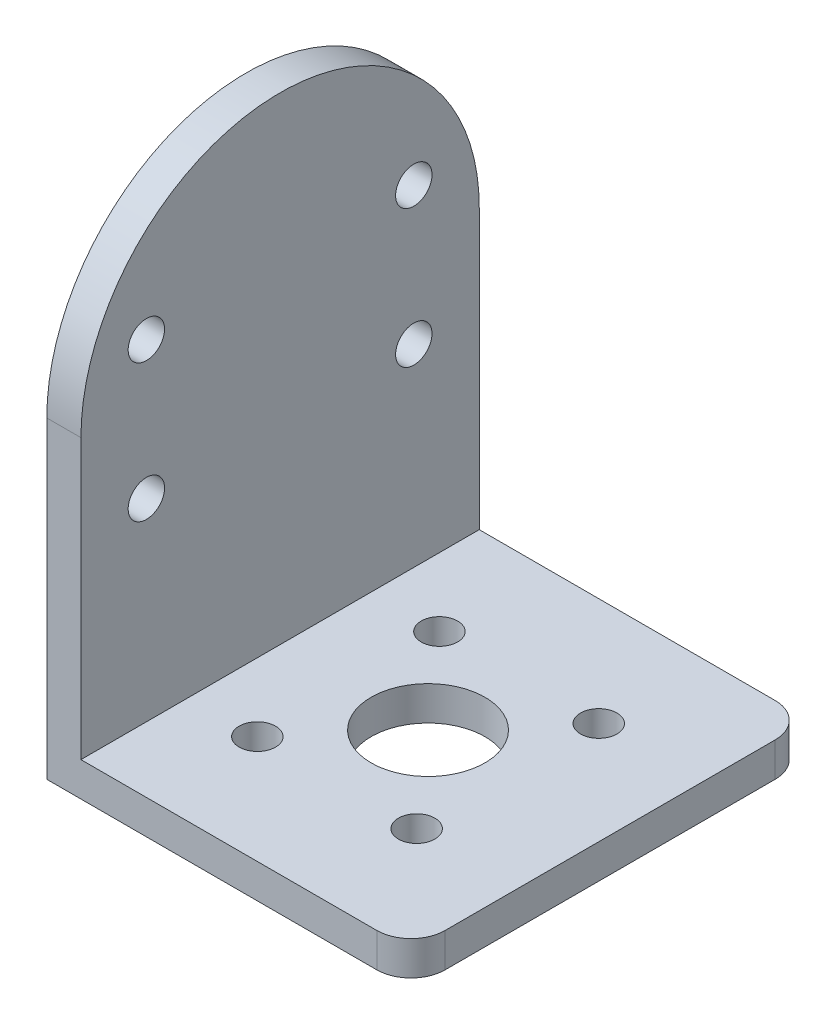
ISO-10303-21;
HEADER;
FILE_DESCRIPTION(('STEP AP214'),'2;1');
FILE_NAME('part.step','',(''),(''),'','','');
FILE_SCHEMA(('AUTOMOTIVE_DESIGN { 1 0 10303 214 1 1 1 1 }'));
ENDSEC;
DATA;
#1=APPLICATION_CONTEXT('core data for automotive mechanical design processes');
#2=APPLICATION_PROTOCOL_DEFINITION('international standard','automotive_design',2000,#1);
#3=PRODUCT_CONTEXT('',#1,'mechanical');
#4=PRODUCT('Part','Part','',(#3));
#5=PRODUCT_RELATED_PRODUCT_CATEGORY('part','',(#4));
#6=PRODUCT_DEFINITION_FORMATION('','',#4);
#7=PRODUCT_DEFINITION_CONTEXT('part definition',#1,'design');
#8=PRODUCT_DEFINITION('design','',#6,#7);
#9=PRODUCT_DEFINITION_SHAPE('','',#8);
#10=(LENGTH_UNIT() NAMED_UNIT(*) SI_UNIT(.MILLI.,.METRE.));
#11=(NAMED_UNIT(*) PLANE_ANGLE_UNIT() SI_UNIT($,.RADIAN.));
#12=(NAMED_UNIT(*) SI_UNIT($,.STERADIAN.) SOLID_ANGLE_UNIT());
#13=UNCERTAINTY_MEASURE_WITH_UNIT(LENGTH_MEASURE(1.E-05),#10,'distance_accuracy_value','');
#14=(GEOMETRIC_REPRESENTATION_CONTEXT(3) GLOBAL_UNCERTAINTY_ASSIGNED_CONTEXT((#13)) GLOBAL_UNIT_ASSIGNED_CONTEXT((#10,
#11,#12)) REPRESENTATION_CONTEXT('',''));
#15=CARTESIAN_POINT('',(0.,0.,0.));
#16=DIRECTION('',(0.,0.,1.));
#17=DIRECTION('',(1.,0.,0.));
#18=AXIS2_PLACEMENT_3D('',#15,#16,#17);
#19=CARTESIAN_POINT('',(3.,45.,17.5));
#20=DIRECTION('',(-1.,0.,0.));
#21=DIRECTION('',(0.,-1.,0.));
#22=AXIS2_PLACEMENT_3D('',#19,#20,#21);
#23=PLANE('',#22);
#24=CARTESIAN_POINT('',(3.,32.09,11.75));
#25=DIRECTION('',(1.,0.,0.));
#26=DIRECTION('',(0.,1.,0.));
#27=AXIS2_PLACEMENT_3D('',#24,#25,#26);
#28=CIRCLE('',#27,1.6);
#29=CARTESIAN_POINT('',(3.,33.69,11.75));
#30=VERTEX_POINT('',#29);
#31=EDGE_CURVE('E192',#30,#30,#28,.T.);
#32=ORIENTED_EDGE('',*,*,#31,.F.);
#33=EDGE_LOOP('',(#32));
#34=FACE_BOUND('',#33,.T.);
#35=CARTESIAN_POINT('',(3.,20.,-11.75));
#36=DIRECTION('',(1.,0.,0.));
#37=DIRECTION('',(0.,1.,0.));
#38=AXIS2_PLACEMENT_3D('',#35,#36,#37);
#39=CIRCLE('',#38,1.6);
#40=CARTESIAN_POINT('',(3.,21.6,-11.75));
#41=VERTEX_POINT('',#40);
#42=EDGE_CURVE('E259',#41,#41,#39,.F.);
#43=ORIENTED_EDGE('',*,*,#42,.T.);
#44=EDGE_LOOP('',(#43));
#45=FACE_BOUND('',#44,.T.);
#46=CARTESIAN_POINT('',(3.,32.09,-11.75));
#47=DIRECTION('',(1.,0.,0.));
#48=DIRECTION('',(0.,1.,0.));
#49=AXIS2_PLACEMENT_3D('',#46,#47,#48);
#50=CIRCLE('',#49,1.6);
#51=CARTESIAN_POINT('',(3.,33.69,-11.75));
#52=VERTEX_POINT('',#51);
#53=EDGE_CURVE('E258',#52,#52,#50,.T.);
#54=ORIENTED_EDGE('',*,*,#53,.F.);
#55=EDGE_LOOP('',(#54));
#56=FACE_BOUND('',#55,.T.);
#57=DIRECTION('',(0.,1.,0.));
#58=VECTOR('',#57,1.);
#59=CARTESIAN_POINT('',(3.,45.,-17.5));
#60=LINE('',#59,#58);
#61=CARTESIAN_POINT('',(3.,3.,-17.5));
#62=VERTEX_POINT('',#61);
#63=CARTESIAN_POINT('',(3.,27.5,-17.5));
#64=VERTEX_POINT('',#63);
#65=EDGE_CURVE('E151',#62,#64,#60,.T.);
#66=ORIENTED_EDGE('',*,*,#65,.T.);
#67=CARTESIAN_POINT('',(3.,27.5,0.));
#68=DIRECTION('',(1.,0.,0.));
#69=DIRECTION('',(0.,1.,0.));
#70=AXIS2_PLACEMENT_3D('',#67,#68,#69);
#71=CIRCLE('',#70,17.5);
#72=CARTESIAN_POINT('',(3.,27.5,17.5));
#73=VERTEX_POINT('',#72);
#74=EDGE_CURVE('E134',#64,#73,#71,.T.);
#75=ORIENTED_EDGE('',*,*,#74,.T.);
#76=DIRECTION('',(0.,1.,0.));
#77=VECTOR('',#76,1.);
#78=CARTESIAN_POINT('',(3.,45.,17.5));
#79=LINE('',#78,#77);
#80=CARTESIAN_POINT('',(3.,3.,17.5));
#81=VERTEX_POINT('',#80);
#82=EDGE_CURVE('E244',#81,#73,#79,.T.);
#83=ORIENTED_EDGE('',*,*,#82,.F.);
#84=DIRECTION('',(0.,0.,-1.));
#85=VECTOR('',#84,1.);
#86=CARTESIAN_POINT('',(3.,3.,17.5));
#87=LINE('',#86,#85);
#88=EDGE_CURVE('E159',#81,#62,#87,.T.);
#89=ORIENTED_EDGE('',*,*,#88,.T.);
#90=EDGE_LOOP('',(#66,#75,#83,#89));
#91=FACE_BOUND('',#90,.T.);
#92=CARTESIAN_POINT('',(3.,20.,11.75));
#93=DIRECTION('',(1.,0.,0.));
#94=DIRECTION('',(0.,1.,0.));
#95=AXIS2_PLACEMENT_3D('',#92,#93,#94);
#96=CIRCLE('',#95,1.6);
#97=CARTESIAN_POINT('',(3.,21.6,11.75));
#98=VERTEX_POINT('',#97);
#99=EDGE_CURVE('E263',#98,#98,#96,.T.);
#100=ORIENTED_EDGE('',*,*,#99,.F.);
#101=EDGE_LOOP('',(#100));
#102=FACE_BOUND('',#101,.T.);
#103=ADVANCED_FACE('F67',(#34,#45,#56,#91,#102),#23,.F.);
#104=CARTESIAN_POINT('',(0.,0.,17.5));
#105=DIRECTION('',(1.,0.,0.));
#106=DIRECTION('',(0.,0.,-1.));
#107=AXIS2_PLACEMENT_3D('',#104,#105,#106);
#108=PLANE('',#107);
#109=CARTESIAN_POINT('',(0.,32.09,11.75));
#110=DIRECTION('',(1.,0.,0.));
#111=DIRECTION('',(0.,0.,-1.));
#112=AXIS2_PLACEMENT_3D('',#109,#110,#111);
#113=CIRCLE('',#112,1.6);
#114=CARTESIAN_POINT('',(0.,33.69,11.75));
#115=VERTEX_POINT('',#114);
#116=EDGE_CURVE('E196',#115,#115,#113,.T.);
#117=ORIENTED_EDGE('',*,*,#116,.T.);
#118=EDGE_LOOP('',(#117));
#119=FACE_BOUND('',#118,.T.);
#120=CARTESIAN_POINT('',(0.,20.,-11.75));
#121=DIRECTION('',(1.,0.,0.));
#122=DIRECTION('',(0.,0.,-1.));
#123=AXIS2_PLACEMENT_3D('',#120,#121,#122);
#124=CIRCLE('',#123,1.6);
#125=CARTESIAN_POINT('',(0.,21.6,-11.75));
#126=VERTEX_POINT('',#125);
#127=EDGE_CURVE('E187',#126,#126,#124,.F.);
#128=ORIENTED_EDGE('',*,*,#127,.F.);
#129=EDGE_LOOP('',(#128));
#130=FACE_BOUND('',#129,.T.);
#131=CARTESIAN_POINT('',(0.,32.09,-11.75));
#132=DIRECTION('',(1.,0.,0.));
#133=DIRECTION('',(0.,0.,-1.));
#134=AXIS2_PLACEMENT_3D('',#131,#132,#133);
#135=CIRCLE('',#134,1.6);
#136=CARTESIAN_POINT('',(0.,33.69,-11.75));
#137=VERTEX_POINT('',#136);
#138=EDGE_CURVE('E191',#137,#137,#135,.T.);
#139=ORIENTED_EDGE('',*,*,#138,.T.);
#140=EDGE_LOOP('',(#139));
#141=FACE_BOUND('',#140,.T.);
#142=CARTESIAN_POINT('',(0.,27.5,0.));
#143=DIRECTION('',(1.,0.,0.));
#144=DIRECTION('',(0.,0.,-1.));
#145=AXIS2_PLACEMENT_3D('',#142,#143,#144);
#146=CIRCLE('',#145,17.5);
#147=CARTESIAN_POINT('',(0.,27.5,-17.5));
#148=VERTEX_POINT('',#147);
#149=CARTESIAN_POINT('',(0.,27.5,17.5));
#150=VERTEX_POINT('',#149);
#151=EDGE_CURVE('E146',#148,#150,#146,.T.);
#152=ORIENTED_EDGE('',*,*,#151,.F.);
#153=DIRECTION('',(0.,-1.,0.));
#154=VECTOR('',#153,1.);
#155=CARTESIAN_POINT('',(0.,0.,-17.5));
#156=LINE('',#155,#154);
#157=CARTESIAN_POINT('',(0.,0.,-17.5));
#158=VERTEX_POINT('',#157);
#159=EDGE_CURVE('E152',#148,#158,#156,.T.);
#160=ORIENTED_EDGE('',*,*,#159,.T.);
#161=DIRECTION('',(0.,0.,-1.));
#162=VECTOR('',#161,1.);
#163=CARTESIAN_POINT('',(0.,0.,17.5));
#164=LINE('',#163,#162);
#165=CARTESIAN_POINT('',(0.,0.,17.5));
#166=VERTEX_POINT('',#165);
#167=EDGE_CURVE('E171',#166,#158,#164,.T.);
#168=ORIENTED_EDGE('',*,*,#167,.F.);
#169=DIRECTION('',(0.,-1.,0.));
#170=VECTOR('',#169,1.);
#171=CARTESIAN_POINT('',(0.,0.,17.5));
#172=LINE('',#171,#170);
#173=EDGE_CURVE('E175',#150,#166,#172,.T.);
#174=ORIENTED_EDGE('',*,*,#173,.F.);
#175=EDGE_LOOP('',(#152,#160,#168,#174));
#176=FACE_BOUND('',#175,.T.);
#177=CARTESIAN_POINT('',(0.,20.,11.75));
#178=DIRECTION('',(1.,0.,0.));
#179=DIRECTION('',(0.,0.,-1.));
#180=AXIS2_PLACEMENT_3D('',#177,#178,#179);
#181=CIRCLE('',#180,1.6);
#182=CARTESIAN_POINT('',(0.,21.6,11.75));
#183=VERTEX_POINT('',#182);
#184=EDGE_CURVE('E147',#183,#183,#181,.T.);
#185=ORIENTED_EDGE('',*,*,#184,.T.);
#186=EDGE_LOOP('',(#185));
#187=FACE_BOUND('',#186,.T.);
#188=ADVANCED_FACE('F337',(#119,#130,#141,#176,#187),#108,.F.);
#189=CARTESIAN_POINT('',(0.,0.,-17.5));
#190=DIRECTION('',(0.,0.,-1.));
#191=DIRECTION('',(-1.,0.,0.));
#192=AXIS2_PLACEMENT_3D('',#189,#190,#191);
#193=PLANE('',#192);
#194=DIRECTION('',(-1.,0.,0.));
#195=VECTOR('',#194,1.);
#196=CARTESIAN_POINT('',(3.,3.,-17.5));
#197=LINE('',#196,#195);
#198=CARTESIAN_POINT('',(29.,3.,-17.5));
#199=VERTEX_POINT('',#198);
#200=EDGE_CURVE('E161',#199,#62,#197,.T.);
#201=ORIENTED_EDGE('',*,*,#200,.F.);
#202=DIRECTION('',(0.,1.,0.));
#203=VECTOR('',#202,1.);
#204=CARTESIAN_POINT('',(29.,0.,-17.5));
#205=LINE('',#204,#203);
#206=CARTESIAN_POINT('',(29.,0.,-17.5));
#207=VERTEX_POINT('',#206);
#208=EDGE_CURVE('E12',#199,#207,#205,.F.);
#209=ORIENTED_EDGE('',*,*,#208,.T.);
#210=DIRECTION('',(1.,0.,0.));
#211=VECTOR('',#210,1.);
#212=CARTESIAN_POINT('',(32.,0.,-17.5));
#213=LINE('',#212,#211);
#214=EDGE_CURVE('E167',#158,#207,#213,.T.);
#215=ORIENTED_EDGE('',*,*,#214,.F.);
#216=ORIENTED_EDGE('',*,*,#159,.F.);
#217=DIRECTION('',(1.,0.,0.));
#218=VECTOR('',#217,1.);
#219=CARTESIAN_POINT('',(-23.,27.5,-17.5));
#220=LINE('',#219,#218);
#221=EDGE_CURVE('E137',#148,#64,#220,.T.);
#222=ORIENTED_EDGE('',*,*,#221,.T.);
#223=ORIENTED_EDGE('',*,*,#65,.F.);
#224=EDGE_LOOP('',(#201,#209,#215,#216,#222,#223));
#225=FACE_BOUND('',#224,.T.);
#226=ADVANCED_FACE('F150',(#225),#193,.T.);
#227=CARTESIAN_POINT('',(0.,0.,17.5));
#228=DIRECTION('',(0.,0.,-1.));
#229=DIRECTION('',(-1.,0.,0.));
#230=AXIS2_PLACEMENT_3D('',#227,#228,#229);
#231=PLANE('',#230);
#232=DIRECTION('',(1.,0.,0.));
#233=VECTOR('',#232,1.);
#234=CARTESIAN_POINT('',(32.,0.,17.5));
#235=LINE('',#234,#233);
#236=CARTESIAN_POINT('',(29.,0.,17.5));
#237=VERTEX_POINT('',#236);
#238=EDGE_CURVE('E165',#166,#237,#235,.T.);
#239=ORIENTED_EDGE('',*,*,#238,.T.);
#240=DIRECTION('',(0.,1.,0.));
#241=VECTOR('',#240,1.);
#242=CARTESIAN_POINT('',(29.,0.,17.5));
#243=LINE('',#242,#241);
#244=CARTESIAN_POINT('',(29.,3.,17.5));
#245=VERTEX_POINT('',#244);
#246=EDGE_CURVE('E154',#237,#245,#243,.T.);
#247=ORIENTED_EDGE('',*,*,#246,.T.);
#248=DIRECTION('',(-1.,0.,0.));
#249=VECTOR('',#248,1.);
#250=CARTESIAN_POINT('',(3.,3.,17.5));
#251=LINE('',#250,#249);
#252=EDGE_CURVE('E234',#245,#81,#251,.T.);
#253=ORIENTED_EDGE('',*,*,#252,.T.);
#254=ORIENTED_EDGE('',*,*,#82,.T.);
#255=DIRECTION('',(1.,0.,0.));
#256=VECTOR('',#255,1.);
#257=CARTESIAN_POINT('',(-23.,27.5,17.5));
#258=LINE('',#257,#256);
#259=EDGE_CURVE('E140',#150,#73,#258,.T.);
#260=ORIENTED_EDGE('',*,*,#259,.F.);
#261=ORIENTED_EDGE('',*,*,#173,.T.);
#262=EDGE_LOOP('',(#239,#247,#253,#254,#260,#261));
#263=FACE_BOUND('',#262,.T.);
#264=ADVANCED_FACE('F229',(#263),#231,.F.);
#265=CARTESIAN_POINT('',(32.,0.,17.5));
#266=DIRECTION('',(0.,1.,0.));
#267=DIRECTION('',(-1.,0.,0.));
#268=AXIS2_PLACEMENT_3D('',#265,#266,#267);
#269=PLANE('',#268);
#270=CARTESIAN_POINT('',(9.,0.,8.));
#271=DIRECTION('',(0.,1.,0.));
#272=DIRECTION('',(0.,0.,1.));
#273=AXIS2_PLACEMENT_3D('',#270,#271,#272);
#274=CIRCLE('',#273,1.6);
#275=CARTESIAN_POINT('',(9.,0.,9.6));
#276=VERTEX_POINT('',#275);
#277=EDGE_CURVE('E279',#276,#276,#274,.T.);
#278=ORIENTED_EDGE('',*,*,#277,.T.);
#279=EDGE_LOOP('',(#278));
#280=FACE_BOUND('',#279,.T.);
#281=CARTESIAN_POINT('',(23.,0.,8.));
#282=DIRECTION('',(0.,1.,0.));
#283=DIRECTION('',(0.,0.,1.));
#284=AXIS2_PLACEMENT_3D('',#281,#282,#283);
#285=CIRCLE('',#284,1.6);
#286=CARTESIAN_POINT('',(23.,0.,9.6));
#287=VERTEX_POINT('',#286);
#288=EDGE_CURVE('E287',#287,#287,#285,.T.);
#289=ORIENTED_EDGE('',*,*,#288,.T.);
#290=EDGE_LOOP('',(#289));
#291=FACE_BOUND('',#290,.T.);
#292=CARTESIAN_POINT('',(23.,0.,-8.));
#293=DIRECTION('',(0.,1.,0.));
#294=DIRECTION('',(0.,0.,1.));
#295=AXIS2_PLACEMENT_3D('',#292,#293,#294);
#296=CIRCLE('',#295,1.6);
#297=CARTESIAN_POINT('',(23.,0.,-6.4));
#298=VERTEX_POINT('',#297);
#299=EDGE_CURVE('E295',#298,#298,#296,.T.);
#300=ORIENTED_EDGE('',*,*,#299,.T.);
#301=EDGE_LOOP('',(#300));
#302=FACE_BOUND('',#301,.T.);
#303=CARTESIAN_POINT('',(9.,0.,-8.));
#304=DIRECTION('',(0.,1.,0.));
#305=DIRECTION('',(0.,0.,1.));
#306=AXIS2_PLACEMENT_3D('',#303,#304,#305);
#307=CIRCLE('',#306,1.6);
#308=CARTESIAN_POINT('',(9.,0.,-6.4));
#309=VERTEX_POINT('',#308);
#310=EDGE_CURVE('E303',#309,#309,#307,.T.);
#311=ORIENTED_EDGE('',*,*,#310,.T.);
#312=EDGE_LOOP('',(#311));
#313=FACE_BOUND('',#312,.T.);
#314=CARTESIAN_POINT('',(16.,0.,0.));
#315=DIRECTION('',(0.,1.,0.));
#316=DIRECTION('',(0.,0.,1.));
#317=AXIS2_PLACEMENT_3D('',#314,#315,#316);
#318=CIRCLE('',#317,5.);
#319=CARTESIAN_POINT('',(16.,0.,5.));
#320=VERTEX_POINT('',#319);
#321=EDGE_CURVE('E270',#320,#320,#318,.T.);
#322=ORIENTED_EDGE('',*,*,#321,.T.);
#323=EDGE_LOOP('',(#322));
#324=FACE_BOUND('',#323,.T.);
#325=DIRECTION('',(0.,0.,-1.));
#326=VECTOR('',#325,1.);
#327=CARTESIAN_POINT('',(32.,0.,17.5));
#328=LINE('',#327,#326);
#329=CARTESIAN_POINT('',(32.,0.,14.5));
#330=VERTEX_POINT('',#329);
#331=CARTESIAN_POINT('',(32.,0.,-14.5));
#332=VERTEX_POINT('',#331);
#333=EDGE_CURVE('E182',#330,#332,#328,.T.);
#334=ORIENTED_EDGE('',*,*,#333,.F.);
#335=CARTESIAN_POINT('',(29.,0.,14.5));
#336=DIRECTION('',(0.,1.,0.));
#337=DIRECTION('',(-1.,0.,0.));
#338=AXIS2_PLACEMENT_3D('',#335,#336,#337);
#339=CIRCLE('',#338,3.);
#340=EDGE_CURVE('E76',#330,#237,#339,.F.);
#341=ORIENTED_EDGE('',*,*,#340,.T.);
#342=ORIENTED_EDGE('',*,*,#238,.F.);
#343=ORIENTED_EDGE('',*,*,#167,.T.);
#344=ORIENTED_EDGE('',*,*,#214,.T.);
#345=CARTESIAN_POINT('',(29.,0.,-14.5));
#346=DIRECTION('',(0.,1.,0.));
#347=DIRECTION('',(-1.,0.,0.));
#348=AXIS2_PLACEMENT_3D('',#345,#346,#347);
#349=CIRCLE('',#348,3.);
#350=EDGE_CURVE('E88',#207,#332,#349,.F.);
#351=ORIENTED_EDGE('',*,*,#350,.T.);
#352=EDGE_LOOP('',(#334,#341,#342,#343,#344,#351));
#353=FACE_BOUND('',#352,.T.);
#354=ADVANCED_FACE('F224',(#280,#291,#302,#313,#324,#353),#269,.F.);
#355=CARTESIAN_POINT('',(32.,3.,17.5));
#356=DIRECTION('',(-1.,0.,0.));
#357=DIRECTION('',(0.,0.,1.));
#358=AXIS2_PLACEMENT_3D('',#355,#356,#357);
#359=PLANE('',#358);
#360=DIRECTION('',(0.,0.,-1.));
#361=VECTOR('',#360,1.);
#362=CARTESIAN_POINT('',(32.,3.,17.5));
#363=LINE('',#362,#361);
#364=CARTESIAN_POINT('',(32.,3.,14.5));
#365=VERTEX_POINT('',#364);
#366=CARTESIAN_POINT('',(32.,3.,-14.5));
#367=VERTEX_POINT('',#366);
#368=EDGE_CURVE('E178',#365,#367,#363,.T.);
#369=ORIENTED_EDGE('',*,*,#368,.F.);
#370=DIRECTION('',(0.,1.,0.));
#371=VECTOR('',#370,1.);
#372=CARTESIAN_POINT('',(32.,3.,14.5));
#373=LINE('',#372,#371);
#374=EDGE_CURVE('E216',#365,#330,#373,.F.);
#375=ORIENTED_EDGE('',*,*,#374,.T.);
#376=ORIENTED_EDGE('',*,*,#333,.T.);
#377=DIRECTION('',(0.,1.,0.));
#378=VECTOR('',#377,1.);
#379=CARTESIAN_POINT('',(32.,3.,-14.5));
#380=LINE('',#379,#378);
#381=EDGE_CURVE('E212',#332,#367,#380,.T.);
#382=ORIENTED_EDGE('',*,*,#381,.T.);
#383=EDGE_LOOP('',(#369,#375,#376,#382));
#384=FACE_BOUND('',#383,.T.);
#385=ADVANCED_FACE('F241',(#384),#359,.F.);
#386=CARTESIAN_POINT('',(3.,3.,17.5));
#387=DIRECTION('',(0.,-1.,0.));
#388=DIRECTION('',(0.,0.,-1.));
#389=AXIS2_PLACEMENT_3D('',#386,#387,#388);
#390=PLANE('',#389);
#391=CARTESIAN_POINT('',(9.,3.,8.));
#392=DIRECTION('',(0.,1.,0.));
#393=DIRECTION('',(0.,0.,1.));
#394=AXIS2_PLACEMENT_3D('',#391,#392,#393);
#395=CIRCLE('',#394,1.6);
#396=CARTESIAN_POINT('',(9.,3.,9.6));
#397=VERTEX_POINT('',#396);
#398=EDGE_CURVE('E283',#397,#397,#395,.T.);
#399=ORIENTED_EDGE('',*,*,#398,.F.);
#400=EDGE_LOOP('',(#399));
#401=FACE_BOUND('',#400,.T.);
#402=CARTESIAN_POINT('',(23.,3.,8.));
#403=DIRECTION('',(0.,1.,0.));
#404=DIRECTION('',(0.,0.,1.));
#405=AXIS2_PLACEMENT_3D('',#402,#403,#404);
#406=CIRCLE('',#405,1.6);
#407=CARTESIAN_POINT('',(23.,3.,9.6));
#408=VERTEX_POINT('',#407);
#409=EDGE_CURVE('E291',#408,#408,#406,.T.);
#410=ORIENTED_EDGE('',*,*,#409,.F.);
#411=EDGE_LOOP('',(#410));
#412=FACE_BOUND('',#411,.T.);
#413=CARTESIAN_POINT('',(23.,3.,-8.));
#414=DIRECTION('',(0.,1.,0.));
#415=DIRECTION('',(0.,0.,1.));
#416=AXIS2_PLACEMENT_3D('',#413,#414,#415);
#417=CIRCLE('',#416,1.6);
#418=CARTESIAN_POINT('',(23.,3.,-6.4));
#419=VERTEX_POINT('',#418);
#420=EDGE_CURVE('E299',#419,#419,#417,.T.);
#421=ORIENTED_EDGE('',*,*,#420,.F.);
#422=EDGE_LOOP('',(#421));
#423=FACE_BOUND('',#422,.T.);
#424=CARTESIAN_POINT('',(9.,3.,-8.));
#425=DIRECTION('',(0.,1.,0.));
#426=DIRECTION('',(0.,0.,1.));
#427=AXIS2_PLACEMENT_3D('',#424,#425,#426);
#428=CIRCLE('',#427,1.6);
#429=CARTESIAN_POINT('',(9.,3.,-6.4));
#430=VERTEX_POINT('',#429);
#431=EDGE_CURVE('E275',#430,#430,#428,.T.);
#432=ORIENTED_EDGE('',*,*,#431,.F.);
#433=EDGE_LOOP('',(#432));
#434=FACE_BOUND('',#433,.T.);
#435=CARTESIAN_POINT('',(16.,3.,0.));
#436=DIRECTION('',(0.,1.,0.));
#437=DIRECTION('',(0.,0.,1.));
#438=AXIS2_PLACEMENT_3D('',#435,#436,#437);
#439=CIRCLE('',#438,5.);
#440=CARTESIAN_POINT('',(16.,3.,5.));
#441=VERTEX_POINT('',#440);
#442=EDGE_CURVE('E271',#441,#441,#439,.T.);
#443=ORIENTED_EDGE('',*,*,#442,.F.);
#444=EDGE_LOOP('',(#443));
#445=FACE_BOUND('',#444,.T.);
#446=ORIENTED_EDGE('',*,*,#252,.F.);
#447=CARTESIAN_POINT('',(29.,3.,14.5));
#448=DIRECTION('',(0.,-1.,0.));
#449=DIRECTION('',(0.,0.,-1.));
#450=AXIS2_PLACEMENT_3D('',#447,#448,#449);
#451=CIRCLE('',#450,3.);
#452=EDGE_CURVE('E209',#245,#365,#451,.F.);
#453=ORIENTED_EDGE('',*,*,#452,.T.);
#454=ORIENTED_EDGE('',*,*,#368,.T.);
#455=CARTESIAN_POINT('',(29.,3.,-14.5));
#456=DIRECTION('',(0.,-1.,0.));
#457=DIRECTION('',(0.,0.,-1.));
#458=AXIS2_PLACEMENT_3D('',#455,#456,#457);
#459=CIRCLE('',#458,3.);
#460=EDGE_CURVE('E206',#367,#199,#459,.F.);
#461=ORIENTED_EDGE('',*,*,#460,.T.);
#462=ORIENTED_EDGE('',*,*,#200,.T.);
#463=ORIENTED_EDGE('',*,*,#88,.F.);
#464=EDGE_LOOP('',(#446,#453,#454,#461,#462,#463));
#465=FACE_BOUND('',#464,.T.);
#466=ADVANCED_FACE('F239',(#401,#412,#423,#434,#445,#465),#390,.F.);
#467=CARTESIAN_POINT('',(-23.,27.5,0.));
#468=DIRECTION('',(1.,0.,0.));
#469=DIRECTION('',(0.,1.,0.));
#470=AXIS2_PLACEMENT_3D('',#467,#468,#469);
#471=CYLINDRICAL_SURFACE('',#470,17.5);
#472=ORIENTED_EDGE('',*,*,#151,.T.);
#473=ORIENTED_EDGE('',*,*,#259,.T.);
#474=ORIENTED_EDGE('',*,*,#74,.F.);
#475=ORIENTED_EDGE('',*,*,#221,.F.);
#476=EDGE_LOOP('',(#472,#473,#474,#475));
#477=FACE_BOUND('',#476,.T.);
#478=ADVANCED_FACE('F136',(#477),#471,.T.);
#479=CARTESIAN_POINT('',(-23.,20.,-11.75));
#480=DIRECTION('',(1.,0.,0.));
#481=DIRECTION('',(0.,1.,0.));
#482=AXIS2_PLACEMENT_3D('',#479,#480,#481);
#483=CYLINDRICAL_SURFACE('',#482,1.6);
#484=CARTESIAN_POINT('',(3.,21.6,-11.75));
#485=CARTESIAN_POINT('',(2.96875,21.6,-11.75));
#486=CARTESIAN_POINT('',(2.9375,21.6,-11.75));
#487=CARTESIAN_POINT('',(2.875,21.6,-11.75));
#488=CARTESIAN_POINT('',(2.84375,21.6,-11.75));
#489=CARTESIAN_POINT('',(2.78125,21.6,-11.75));
#490=CARTESIAN_POINT('',(2.75,21.6,-11.75));
#491=CARTESIAN_POINT('',(2.6875,21.6,-11.75));
#492=CARTESIAN_POINT('',(2.65625,21.6,-11.75));
#493=CARTESIAN_POINT('',(2.59375,21.6,-11.75));
#494=CARTESIAN_POINT('',(2.5625,21.6,-11.75));
#495=CARTESIAN_POINT('',(2.5,21.6,-11.75));
#496=CARTESIAN_POINT('',(2.46875,21.6,-11.75));
#497=CARTESIAN_POINT('',(2.40625,21.6,-11.75));
#498=CARTESIAN_POINT('',(2.375,21.6,-11.75));
#499=CARTESIAN_POINT('',(2.3125,21.6,-11.75));
#500=CARTESIAN_POINT('',(2.28125,21.6,-11.75));
#501=CARTESIAN_POINT('',(2.21875,21.6,-11.75));
#502=CARTESIAN_POINT('',(2.1875,21.6,-11.75));
#503=CARTESIAN_POINT('',(2.125,21.6,-11.75));
#504=CARTESIAN_POINT('',(2.09375,21.6,-11.75));
#505=CARTESIAN_POINT('',(2.03125,21.6,-11.75));
#506=CARTESIAN_POINT('',(2.,21.6,-11.75));
#507=CARTESIAN_POINT('',(1.9375,21.6,-11.75));
#508=CARTESIAN_POINT('',(1.90625,21.6,-11.75));
#509=CARTESIAN_POINT('',(1.84375,21.6,-11.75));
#510=CARTESIAN_POINT('',(1.8125,21.6,-11.75));
#511=CARTESIAN_POINT('',(1.75,21.6,-11.75));
#512=CARTESIAN_POINT('',(1.71875,21.6,-11.75));
#513=CARTESIAN_POINT('',(1.65625,21.6,-11.75));
#514=CARTESIAN_POINT('',(1.625,21.6,-11.75));
#515=CARTESIAN_POINT('',(1.5625,21.6,-11.75));
#516=CARTESIAN_POINT('',(1.53125,21.6,-11.75));
#517=CARTESIAN_POINT('',(1.46875,21.6,-11.75));
#518=CARTESIAN_POINT('',(1.4375,21.6,-11.75));
#519=CARTESIAN_POINT('',(1.375,21.6,-11.75));
#520=CARTESIAN_POINT('',(1.34375,21.6,-11.75));
#521=CARTESIAN_POINT('',(1.28125,21.6,-11.75));
#522=CARTESIAN_POINT('',(1.25,21.6,-11.75));
#523=CARTESIAN_POINT('',(1.1875,21.6,-11.75));
#524=CARTESIAN_POINT('',(1.15625,21.6,-11.75));
#525=CARTESIAN_POINT('',(1.09375,21.6,-11.75));
#526=CARTESIAN_POINT('',(1.0625,21.6,-11.75));
#527=CARTESIAN_POINT('',(0.999999999999997,21.6,-11.75));
#528=CARTESIAN_POINT('',(0.968749999999997,21.6,-11.75));
#529=CARTESIAN_POINT('',(0.906249999999997,21.6,-11.75));
#530=CARTESIAN_POINT('',(0.874999999999997,21.6,-11.75));
#531=CARTESIAN_POINT('',(0.812499999999997,21.6,-11.75));
#532=CARTESIAN_POINT('',(0.781249999999997,21.6,-11.75));
#533=CARTESIAN_POINT('',(0.718749999999997,21.6,-11.75));
#534=CARTESIAN_POINT('',(0.687499999999997,21.6,-11.75));
#535=CARTESIAN_POINT('',(0.624999999999997,21.6,-11.75));
#536=CARTESIAN_POINT('',(0.593749999999997,21.6,-11.75));
#537=CARTESIAN_POINT('',(0.531249999999997,21.6,-11.75));
#538=CARTESIAN_POINT('',(0.499999999999997,21.6,-11.75));
#539=CARTESIAN_POINT('',(0.437499999999997,21.6,-11.75));
#540=CARTESIAN_POINT('',(0.406249999999997,21.6,-11.75));
#541=CARTESIAN_POINT('',(0.343749999999997,21.6,-11.75));
#542=CARTESIAN_POINT('',(0.312499999999997,21.6,-11.75));
#543=CARTESIAN_POINT('',(0.249999999999997,21.6,-11.75));
#544=CARTESIAN_POINT('',(0.218749999999997,21.6,-11.75));
#545=CARTESIAN_POINT('',(0.156249999999997,21.6,-11.75));
#546=CARTESIAN_POINT('',(0.124999999999997,21.6,-11.75));
#547=CARTESIAN_POINT('',(0.0624999999999966,21.6,-11.75));
#548=CARTESIAN_POINT('',(0.0312499999999966,21.6,-11.75));
#549=CARTESIAN_POINT('',(0.,21.6,-11.75));
#550=B_SPLINE_CURVE_WITH_KNOTS('',3,(#484,#485,#486,#487,#488,#489,#490,#491,#492,#493,#494,
#495,#496,#497,#498,#499,#500,#501,#502,#503,#504,#505,#506,#507,#508,#509,#510,#511,#512,#513,
#514,#515,#516,#517,#518,#519,#520,#521,#522,#523,#524,#525,#526,#527,#528,#529,#530,#531,#532,
#533,#534,#535,#536,#537,#538,#539,#540,#541,#542,#543,#544,#545,#546,#547,#548,#549),
.UNSPECIFIED.,.F.,.F.,(4,2,2,2,2,2,2,2,2,2,2,2,2,2,2,2,2,2,2,2,2,2,2,2,2,2,2,2,2,2,2,2,4),(0.,
0.0937500000000001,0.1875,0.28125,0.375,0.46875,0.5625,0.656250000000001,0.750000000000001,
0.843750000000001,0.937500000000001,1.03125,1.125,1.21875,1.3125,1.40625,1.5,1.59375,1.6875,
1.78125,1.875,1.96875,2.0625,2.15625,2.25,2.34375,2.4375,2.53125,2.625,2.71875,2.8125,2.90625,
3.),.UNSPECIFIED.);
#551=EDGE_CURVE('BSEAM486',#41,#126,#550,.T.);
#552=ORIENTED_EDGE('',*,*,#42,.F.);
#553=ORIENTED_EDGE('',*,*,#127,.T.);
#554=ORIENTED_EDGE('',*,*,#551,.T.);
#555=ORIENTED_EDGE('',*,*,#551,.F.);
#556=EDGE_LOOP('',(#552,#554,#553,#555));
#557=FACE_BOUND('',#556,.T.);
#558=ADVANCED_FACE('F486',(#557),#483,.F.);
#559=CARTESIAN_POINT('',(-23.,32.09,-11.75));
#560=DIRECTION('',(1.,0.,0.));
#561=DIRECTION('',(0.,1.,0.));
#562=AXIS2_PLACEMENT_3D('',#559,#560,#561);
#563=CYLINDRICAL_SURFACE('',#562,1.6);
#564=CARTESIAN_POINT('',(3.,33.69,-11.75));
#565=CARTESIAN_POINT('',(2.96875,33.69,-11.75));
#566=CARTESIAN_POINT('',(2.9375,33.69,-11.75));
#567=CARTESIAN_POINT('',(2.875,33.69,-11.75));
#568=CARTESIAN_POINT('',(2.84375,33.69,-11.75));
#569=CARTESIAN_POINT('',(2.78125,33.69,-11.75));
#570=CARTESIAN_POINT('',(2.75,33.69,-11.75));
#571=CARTESIAN_POINT('',(2.6875,33.69,-11.75));
#572=CARTESIAN_POINT('',(2.65625,33.69,-11.75));
#573=CARTESIAN_POINT('',(2.59375,33.69,-11.75));
#574=CARTESIAN_POINT('',(2.5625,33.69,-11.75));
#575=CARTESIAN_POINT('',(2.5,33.69,-11.75));
#576=CARTESIAN_POINT('',(2.46875,33.69,-11.75));
#577=CARTESIAN_POINT('',(2.40625,33.69,-11.75));
#578=CARTESIAN_POINT('',(2.375,33.69,-11.75));
#579=CARTESIAN_POINT('',(2.3125,33.69,-11.75));
#580=CARTESIAN_POINT('',(2.28125,33.69,-11.75));
#581=CARTESIAN_POINT('',(2.21875,33.69,-11.75));
#582=CARTESIAN_POINT('',(2.1875,33.69,-11.75));
#583=CARTESIAN_POINT('',(2.125,33.69,-11.75));
#584=CARTESIAN_POINT('',(2.09375,33.69,-11.75));
#585=CARTESIAN_POINT('',(2.03125,33.69,-11.75));
#586=CARTESIAN_POINT('',(2.,33.69,-11.75));
#587=CARTESIAN_POINT('',(1.9375,33.69,-11.75));
#588=CARTESIAN_POINT('',(1.90625,33.69,-11.75));
#589=CARTESIAN_POINT('',(1.84375,33.69,-11.75));
#590=CARTESIAN_POINT('',(1.8125,33.69,-11.75));
#591=CARTESIAN_POINT('',(1.75,33.69,-11.75));
#592=CARTESIAN_POINT('',(1.71875,33.69,-11.75));
#593=CARTESIAN_POINT('',(1.65625,33.69,-11.75));
#594=CARTESIAN_POINT('',(1.625,33.69,-11.75));
#595=CARTESIAN_POINT('',(1.5625,33.69,-11.75));
#596=CARTESIAN_POINT('',(1.53125,33.69,-11.75));
#597=CARTESIAN_POINT('',(1.46875,33.69,-11.75));
#598=CARTESIAN_POINT('',(1.4375,33.69,-11.75));
#599=CARTESIAN_POINT('',(1.375,33.69,-11.75));
#600=CARTESIAN_POINT('',(1.34375,33.69,-11.75));
#601=CARTESIAN_POINT('',(1.28125,33.69,-11.75));
#602=CARTESIAN_POINT('',(1.25,33.69,-11.75));
#603=CARTESIAN_POINT('',(1.1875,33.69,-11.75));
#604=CARTESIAN_POINT('',(1.15625,33.69,-11.75));
#605=CARTESIAN_POINT('',(1.09375,33.69,-11.75));
#606=CARTESIAN_POINT('',(1.0625,33.69,-11.75));
#607=CARTESIAN_POINT('',(0.999999999999997,33.69,-11.75));
#608=CARTESIAN_POINT('',(0.968749999999997,33.69,-11.75));
#609=CARTESIAN_POINT('',(0.906249999999997,33.69,-11.75));
#610=CARTESIAN_POINT('',(0.874999999999997,33.69,-11.75));
#611=CARTESIAN_POINT('',(0.812499999999997,33.69,-11.75));
#612=CARTESIAN_POINT('',(0.781249999999997,33.69,-11.75));
#613=CARTESIAN_POINT('',(0.718749999999997,33.69,-11.75));
#614=CARTESIAN_POINT('',(0.687499999999997,33.69,-11.75));
#615=CARTESIAN_POINT('',(0.624999999999997,33.69,-11.75));
#616=CARTESIAN_POINT('',(0.593749999999997,33.69,-11.75));
#617=CARTESIAN_POINT('',(0.531249999999997,33.69,-11.75));
#618=CARTESIAN_POINT('',(0.499999999999997,33.69,-11.75));
#619=CARTESIAN_POINT('',(0.437499999999997,33.69,-11.75));
#620=CARTESIAN_POINT('',(0.406249999999997,33.69,-11.75));
#621=CARTESIAN_POINT('',(0.343749999999997,33.69,-11.75));
#622=CARTESIAN_POINT('',(0.312499999999997,33.69,-11.75));
#623=CARTESIAN_POINT('',(0.249999999999997,33.69,-11.75));
#624=CARTESIAN_POINT('',(0.218749999999997,33.69,-11.75));
#625=CARTESIAN_POINT('',(0.156249999999997,33.69,-11.75));
#626=CARTESIAN_POINT('',(0.124999999999997,33.69,-11.75));
#627=CARTESIAN_POINT('',(0.0624999999999966,33.69,-11.75));
#628=CARTESIAN_POINT('',(0.0312499999999966,33.69,-11.75));
#629=CARTESIAN_POINT('',(0.,33.69,-11.75));
#630=B_SPLINE_CURVE_WITH_KNOTS('',3,(#564,#565,#566,#567,#568,#569,#570,#571,#572,#573,#574,
#575,#576,#577,#578,#579,#580,#581,#582,#583,#584,#585,#586,#587,#588,#589,#590,#591,#592,#593,
#594,#595,#596,#597,#598,#599,#600,#601,#602,#603,#604,#605,#606,#607,#608,#609,#610,#611,#612,
#613,#614,#615,#616,#617,#618,#619,#620,#621,#622,#623,#624,#625,#626,#627,#628,#629),
.UNSPECIFIED.,.F.,.F.,(4,2,2,2,2,2,2,2,2,2,2,2,2,2,2,2,2,2,2,2,2,2,2,2,2,2,2,2,2,2,2,2,4),(0.,
0.0937500000000001,0.1875,0.28125,0.375,0.46875,0.5625,0.656250000000001,0.750000000000001,
0.843750000000001,0.937500000000001,1.03125,1.125,1.21875,1.3125,1.40625,1.5,1.59375,1.6875,
1.78125,1.875,1.96875,2.0625,2.15625,2.25,2.34375,2.4375,2.53125,2.625,2.71875,2.8125,2.90625,
3.),.UNSPECIFIED.);
#631=EDGE_CURVE('BSEAM476',#52,#137,#630,.T.);
#632=ORIENTED_EDGE('',*,*,#53,.T.);
#633=ORIENTED_EDGE('',*,*,#138,.F.);
#634=ORIENTED_EDGE('',*,*,#631,.T.);
#635=ORIENTED_EDGE('',*,*,#631,.F.);
#636=EDGE_LOOP('',(#632,#634,#633,#635));
#637=FACE_BOUND('',#636,.T.);
#638=ADVANCED_FACE('F476',(#637),#563,.F.);
#639=CARTESIAN_POINT('',(-23.,32.09,11.75));
#640=DIRECTION('',(1.,0.,0.));
#641=DIRECTION('',(0.,1.,0.));
#642=AXIS2_PLACEMENT_3D('',#639,#640,#641);
#643=CYLINDRICAL_SURFACE('',#642,1.6);
#644=CARTESIAN_POINT('',(3.,33.69,11.75));
#645=CARTESIAN_POINT('',(2.96875,33.69,11.75));
#646=CARTESIAN_POINT('',(2.9375,33.69,11.75));
#647=CARTESIAN_POINT('',(2.875,33.69,11.75));
#648=CARTESIAN_POINT('',(2.84375,33.69,11.75));
#649=CARTESIAN_POINT('',(2.78125,33.69,11.75));
#650=CARTESIAN_POINT('',(2.75,33.69,11.75));
#651=CARTESIAN_POINT('',(2.6875,33.69,11.75));
#652=CARTESIAN_POINT('',(2.65625,33.69,11.75));
#653=CARTESIAN_POINT('',(2.59375,33.69,11.75));
#654=CARTESIAN_POINT('',(2.5625,33.69,11.75));
#655=CARTESIAN_POINT('',(2.5,33.69,11.75));
#656=CARTESIAN_POINT('',(2.46875,33.69,11.75));
#657=CARTESIAN_POINT('',(2.40625,33.69,11.75));
#658=CARTESIAN_POINT('',(2.375,33.69,11.75));
#659=CARTESIAN_POINT('',(2.3125,33.69,11.75));
#660=CARTESIAN_POINT('',(2.28125,33.69,11.75));
#661=CARTESIAN_POINT('',(2.21875,33.69,11.75));
#662=CARTESIAN_POINT('',(2.1875,33.69,11.75));
#663=CARTESIAN_POINT('',(2.125,33.69,11.75));
#664=CARTESIAN_POINT('',(2.09375,33.69,11.75));
#665=CARTESIAN_POINT('',(2.03125,33.69,11.75));
#666=CARTESIAN_POINT('',(2.,33.69,11.75));
#667=CARTESIAN_POINT('',(1.9375,33.69,11.75));
#668=CARTESIAN_POINT('',(1.90625,33.69,11.75));
#669=CARTESIAN_POINT('',(1.84375,33.69,11.75));
#670=CARTESIAN_POINT('',(1.8125,33.69,11.75));
#671=CARTESIAN_POINT('',(1.75,33.69,11.75));
#672=CARTESIAN_POINT('',(1.71875,33.69,11.75));
#673=CARTESIAN_POINT('',(1.65625,33.69,11.75));
#674=CARTESIAN_POINT('',(1.625,33.69,11.75));
#675=CARTESIAN_POINT('',(1.5625,33.69,11.75));
#676=CARTESIAN_POINT('',(1.53125,33.69,11.75));
#677=CARTESIAN_POINT('',(1.46875,33.69,11.75));
#678=CARTESIAN_POINT('',(1.4375,33.69,11.75));
#679=CARTESIAN_POINT('',(1.375,33.69,11.75));
#680=CARTESIAN_POINT('',(1.34375,33.69,11.75));
#681=CARTESIAN_POINT('',(1.28125,33.69,11.75));
#682=CARTESIAN_POINT('',(1.25,33.69,11.75));
#683=CARTESIAN_POINT('',(1.1875,33.69,11.75));
#684=CARTESIAN_POINT('',(1.15625,33.69,11.75));
#685=CARTESIAN_POINT('',(1.09375,33.69,11.75));
#686=CARTESIAN_POINT('',(1.0625,33.69,11.75));
#687=CARTESIAN_POINT('',(0.999999999999997,33.69,11.75));
#688=CARTESIAN_POINT('',(0.968749999999997,33.69,11.75));
#689=CARTESIAN_POINT('',(0.906249999999997,33.69,11.75));
#690=CARTESIAN_POINT('',(0.874999999999997,33.69,11.75));
#691=CARTESIAN_POINT('',(0.812499999999997,33.69,11.75));
#692=CARTESIAN_POINT('',(0.781249999999997,33.69,11.75));
#693=CARTESIAN_POINT('',(0.718749999999997,33.69,11.75));
#694=CARTESIAN_POINT('',(0.687499999999997,33.69,11.75));
#695=CARTESIAN_POINT('',(0.624999999999997,33.69,11.75));
#696=CARTESIAN_POINT('',(0.593749999999997,33.69,11.75));
#697=CARTESIAN_POINT('',(0.531249999999997,33.69,11.75));
#698=CARTESIAN_POINT('',(0.499999999999997,33.69,11.75));
#699=CARTESIAN_POINT('',(0.437499999999997,33.69,11.75));
#700=CARTESIAN_POINT('',(0.406249999999997,33.69,11.75));
#701=CARTESIAN_POINT('',(0.343749999999997,33.69,11.75));
#702=CARTESIAN_POINT('',(0.312499999999997,33.69,11.75));
#703=CARTESIAN_POINT('',(0.249999999999997,33.69,11.75));
#704=CARTESIAN_POINT('',(0.218749999999997,33.69,11.75));
#705=CARTESIAN_POINT('',(0.156249999999997,33.69,11.75));
#706=CARTESIAN_POINT('',(0.124999999999997,33.69,11.75));
#707=CARTESIAN_POINT('',(0.0624999999999966,33.69,11.75));
#708=CARTESIAN_POINT('',(0.0312499999999966,33.69,11.75));
#709=CARTESIAN_POINT('',(0.,33.69,11.75));
#710=B_SPLINE_CURVE_WITH_KNOTS('',3,(#644,#645,#646,#647,#648,#649,#650,#651,#652,#653,#654,
#655,#656,#657,#658,#659,#660,#661,#662,#663,#664,#665,#666,#667,#668,#669,#670,#671,#672,#673,
#674,#675,#676,#677,#678,#679,#680,#681,#682,#683,#684,#685,#686,#687,#688,#689,#690,#691,#692,
#693,#694,#695,#696,#697,#698,#699,#700,#701,#702,#703,#704,#705,#706,#707,#708,#709),
.UNSPECIFIED.,.F.,.F.,(4,2,2,2,2,2,2,2,2,2,2,2,2,2,2,2,2,2,2,2,2,2,2,2,2,2,2,2,2,2,2,2,4),(0.,
0.0937500000000001,0.1875,0.28125,0.375,0.46875,0.5625,0.656250000000001,0.750000000000001,
0.843750000000001,0.937500000000001,1.03125,1.125,1.21875,1.3125,1.40625,1.5,1.59375,1.6875,
1.78125,1.875,1.96875,2.0625,2.15625,2.25,2.34375,2.4375,2.53125,2.625,2.71875,2.8125,2.90625,
3.),.UNSPECIFIED.);
#711=EDGE_CURVE('BSEAM331',#30,#115,#710,.T.);
#712=ORIENTED_EDGE('',*,*,#31,.T.);
#713=ORIENTED_EDGE('',*,*,#116,.F.);
#714=ORIENTED_EDGE('',*,*,#711,.T.);
#715=ORIENTED_EDGE('',*,*,#711,.F.);
#716=EDGE_LOOP('',(#712,#714,#713,#715));
#717=FACE_BOUND('',#716,.T.);
#718=ADVANCED_FACE('F331',(#717),#643,.F.);
#719=CARTESIAN_POINT('',(-23.,20.,11.75));
#720=DIRECTION('',(1.,0.,0.));
#721=DIRECTION('',(0.,1.,0.));
#722=AXIS2_PLACEMENT_3D('',#719,#720,#721);
#723=CYLINDRICAL_SURFACE('',#722,1.6);
#724=CARTESIAN_POINT('',(3.,21.6,11.75));
#725=CARTESIAN_POINT('',(2.96875,21.6,11.75));
#726=CARTESIAN_POINT('',(2.9375,21.6,11.75));
#727=CARTESIAN_POINT('',(2.875,21.6,11.75));
#728=CARTESIAN_POINT('',(2.84375,21.6,11.75));
#729=CARTESIAN_POINT('',(2.78125,21.6,11.75));
#730=CARTESIAN_POINT('',(2.75,21.6,11.75));
#731=CARTESIAN_POINT('',(2.6875,21.6,11.75));
#732=CARTESIAN_POINT('',(2.65625,21.6,11.75));
#733=CARTESIAN_POINT('',(2.59375,21.6,11.75));
#734=CARTESIAN_POINT('',(2.5625,21.6,11.75));
#735=CARTESIAN_POINT('',(2.5,21.6,11.75));
#736=CARTESIAN_POINT('',(2.46875,21.6,11.75));
#737=CARTESIAN_POINT('',(2.40625,21.6,11.75));
#738=CARTESIAN_POINT('',(2.375,21.6,11.75));
#739=CARTESIAN_POINT('',(2.3125,21.6,11.75));
#740=CARTESIAN_POINT('',(2.28125,21.6,11.75));
#741=CARTESIAN_POINT('',(2.21875,21.6,11.75));
#742=CARTESIAN_POINT('',(2.1875,21.6,11.75));
#743=CARTESIAN_POINT('',(2.125,21.6,11.75));
#744=CARTESIAN_POINT('',(2.09375,21.6,11.75));
#745=CARTESIAN_POINT('',(2.03125,21.6,11.75));
#746=CARTESIAN_POINT('',(2.,21.6,11.75));
#747=CARTESIAN_POINT('',(1.9375,21.6,11.75));
#748=CARTESIAN_POINT('',(1.90625,21.6,11.75));
#749=CARTESIAN_POINT('',(1.84375,21.6,11.75));
#750=CARTESIAN_POINT('',(1.8125,21.6,11.75));
#751=CARTESIAN_POINT('',(1.75,21.6,11.75));
#752=CARTESIAN_POINT('',(1.71875,21.6,11.75));
#753=CARTESIAN_POINT('',(1.65625,21.6,11.75));
#754=CARTESIAN_POINT('',(1.625,21.6,11.75));
#755=CARTESIAN_POINT('',(1.5625,21.6,11.75));
#756=CARTESIAN_POINT('',(1.53125,21.6,11.75));
#757=CARTESIAN_POINT('',(1.46875,21.6,11.75));
#758=CARTESIAN_POINT('',(1.4375,21.6,11.75));
#759=CARTESIAN_POINT('',(1.375,21.6,11.75));
#760=CARTESIAN_POINT('',(1.34375,21.6,11.75));
#761=CARTESIAN_POINT('',(1.28125,21.6,11.75));
#762=CARTESIAN_POINT('',(1.25,21.6,11.75));
#763=CARTESIAN_POINT('',(1.1875,21.6,11.75));
#764=CARTESIAN_POINT('',(1.15625,21.6,11.75));
#765=CARTESIAN_POINT('',(1.09375,21.6,11.75));
#766=CARTESIAN_POINT('',(1.0625,21.6,11.75));
#767=CARTESIAN_POINT('',(0.999999999999997,21.6,11.75));
#768=CARTESIAN_POINT('',(0.968749999999997,21.6,11.75));
#769=CARTESIAN_POINT('',(0.906249999999997,21.6,11.75));
#770=CARTESIAN_POINT('',(0.874999999999997,21.6,11.75));
#771=CARTESIAN_POINT('',(0.812499999999997,21.6,11.75));
#772=CARTESIAN_POINT('',(0.781249999999997,21.6,11.75));
#773=CARTESIAN_POINT('',(0.718749999999997,21.6,11.75));
#774=CARTESIAN_POINT('',(0.687499999999997,21.6,11.75));
#775=CARTESIAN_POINT('',(0.624999999999997,21.6,11.75));
#776=CARTESIAN_POINT('',(0.593749999999997,21.6,11.75));
#777=CARTESIAN_POINT('',(0.531249999999997,21.6,11.75));
#778=CARTESIAN_POINT('',(0.499999999999997,21.6,11.75));
#779=CARTESIAN_POINT('',(0.437499999999997,21.6,11.75));
#780=CARTESIAN_POINT('',(0.406249999999997,21.6,11.75));
#781=CARTESIAN_POINT('',(0.343749999999997,21.6,11.75));
#782=CARTESIAN_POINT('',(0.312499999999997,21.6,11.75));
#783=CARTESIAN_POINT('',(0.249999999999997,21.6,11.75));
#784=CARTESIAN_POINT('',(0.218749999999997,21.6,11.75));
#785=CARTESIAN_POINT('',(0.156249999999997,21.6,11.75));
#786=CARTESIAN_POINT('',(0.124999999999997,21.6,11.75));
#787=CARTESIAN_POINT('',(0.0624999999999966,21.6,11.75));
#788=CARTESIAN_POINT('',(0.0312499999999966,21.6,11.75));
#789=CARTESIAN_POINT('',(0.,21.6,11.75));
#790=B_SPLINE_CURVE_WITH_KNOTS('',3,(#724,#725,#726,#727,#728,#729,#730,#731,#732,#733,#734,
#735,#736,#737,#738,#739,#740,#741,#742,#743,#744,#745,#746,#747,#748,#749,#750,#751,#752,#753,
#754,#755,#756,#757,#758,#759,#760,#761,#762,#763,#764,#765,#766,#767,#768,#769,#770,#771,#772,
#773,#774,#775,#776,#777,#778,#779,#780,#781,#782,#783,#784,#785,#786,#787,#788,#789),
.UNSPECIFIED.,.F.,.F.,(4,2,2,2,2,2,2,2,2,2,2,2,2,2,2,2,2,2,2,2,2,2,2,2,2,2,2,2,2,2,2,2,4),(0.,
0.0937500000000001,0.1875,0.28125,0.375,0.46875,0.5625,0.656250000000001,0.750000000000001,
0.843750000000001,0.937500000000001,1.03125,1.125,1.21875,1.3125,1.40625,1.5,1.59375,1.6875,
1.78125,1.875,1.96875,2.0625,2.15625,2.25,2.34375,2.4375,2.53125,2.625,2.71875,2.8125,2.90625,
3.),.UNSPECIFIED.);
#791=EDGE_CURVE('BSEAM321',#98,#183,#790,.T.);
#792=ORIENTED_EDGE('',*,*,#99,.T.);
#793=ORIENTED_EDGE('',*,*,#184,.F.);
#794=ORIENTED_EDGE('',*,*,#791,.T.);
#795=ORIENTED_EDGE('',*,*,#791,.F.);
#796=EDGE_LOOP('',(#792,#794,#793,#795));
#797=FACE_BOUND('',#796,.T.);
#798=ADVANCED_FACE('F321',(#797),#723,.F.);
#799=CARTESIAN_POINT('',(16.,0.,0.));
#800=DIRECTION('',(0.,1.,0.));
#801=DIRECTION('',(0.,0.,1.));
#802=AXIS2_PLACEMENT_3D('',#799,#800,#801);
#803=CYLINDRICAL_SURFACE('',#802,5.);
#804=ORIENTED_EDGE('',*,*,#321,.F.);
#805=EDGE_LOOP('',(#804));
#806=FACE_BOUND('',#805,.T.);
#807=ORIENTED_EDGE('',*,*,#442,.T.);
#808=EDGE_LOOP('',(#807));
#809=FACE_BOUND('',#808,.T.);
#810=ADVANCED_FACE('F319',(#806,#809),#803,.F.);
#811=CARTESIAN_POINT('',(9.,0.,-8.));
#812=DIRECTION('',(0.,1.,0.));
#813=DIRECTION('',(0.,0.,1.));
#814=AXIS2_PLACEMENT_3D('',#811,#812,#813);
#815=CYLINDRICAL_SURFACE('',#814,1.6);
#816=ORIENTED_EDGE('',*,*,#310,.F.);
#817=EDGE_LOOP('',(#816));
#818=FACE_BOUND('',#817,.T.);
#819=ORIENTED_EDGE('',*,*,#431,.T.);
#820=EDGE_LOOP('',(#819));
#821=FACE_BOUND('',#820,.T.);
#822=ADVANCED_FACE('F311',(#818,#821),#815,.F.);
#823=CARTESIAN_POINT('',(23.,0.,-8.));
#824=DIRECTION('',(0.,1.,0.));
#825=DIRECTION('',(0.,0.,1.));
#826=AXIS2_PLACEMENT_3D('',#823,#824,#825);
#827=CYLINDRICAL_SURFACE('',#826,1.6);
#828=ORIENTED_EDGE('',*,*,#299,.F.);
#829=EDGE_LOOP('',(#828));
#830=FACE_BOUND('',#829,.T.);
#831=ORIENTED_EDGE('',*,*,#420,.T.);
#832=EDGE_LOOP('',(#831));
#833=FACE_BOUND('',#832,.T.);
#834=ADVANCED_FACE('F328',(#830,#833),#827,.F.);
#835=CARTESIAN_POINT('',(23.,0.,8.));
#836=DIRECTION('',(0.,1.,0.));
#837=DIRECTION('',(0.,0.,1.));
#838=AXIS2_PLACEMENT_3D('',#835,#836,#837);
#839=CYLINDRICAL_SURFACE('',#838,1.6);
#840=ORIENTED_EDGE('',*,*,#288,.F.);
#841=EDGE_LOOP('',(#840));
#842=FACE_BOUND('',#841,.T.);
#843=ORIENTED_EDGE('',*,*,#409,.T.);
#844=EDGE_LOOP('',(#843));
#845=FACE_BOUND('',#844,.T.);
#846=ADVANCED_FACE('F359',(#842,#845),#839,.F.);
#847=CARTESIAN_POINT('',(9.,0.,8.));
#848=DIRECTION('',(0.,1.,0.));
#849=DIRECTION('',(0.,0.,1.));
#850=AXIS2_PLACEMENT_3D('',#847,#848,#849);
#851=CYLINDRICAL_SURFACE('',#850,1.6);
#852=ORIENTED_EDGE('',*,*,#277,.F.);
#853=EDGE_LOOP('',(#852));
#854=FACE_BOUND('',#853,.T.);
#855=ORIENTED_EDGE('',*,*,#398,.T.);
#856=EDGE_LOOP('',(#855));
#857=FACE_BOUND('',#856,.T.);
#858=ADVANCED_FACE('F354',(#854,#857),#851,.F.);
#859=CARTESIAN_POINT('',(29.,0.,14.5));
#860=DIRECTION('',(0.,1.,0.));
#861=DIRECTION('',(0.,0.,1.));
#862=AXIS2_PLACEMENT_3D('',#859,#860,#861);
#863=CYLINDRICAL_SURFACE('',#862,3.);
#864=ORIENTED_EDGE('',*,*,#340,.F.);
#865=ORIENTED_EDGE('',*,*,#374,.F.);
#866=ORIENTED_EDGE('',*,*,#452,.F.);
#867=ORIENTED_EDGE('',*,*,#246,.F.);
#868=EDGE_LOOP('',(#864,#865,#866,#867));
#869=FACE_BOUND('',#868,.T.);
#870=ADVANCED_FACE('F236',(#869),#863,.T.);
#871=CARTESIAN_POINT('',(29.,3.,-14.5));
#872=DIRECTION('',(0.,-1.,0.));
#873=DIRECTION('',(0.,0.,-1.));
#874=AXIS2_PLACEMENT_3D('',#871,#872,#873);
#875=CYLINDRICAL_SURFACE('',#874,3.);
#876=ORIENTED_EDGE('',*,*,#350,.F.);
#877=ORIENTED_EDGE('',*,*,#208,.F.);
#878=ORIENTED_EDGE('',*,*,#460,.F.);
#879=ORIENTED_EDGE('',*,*,#381,.F.);
#880=EDGE_LOOP('',(#876,#877,#878,#879));
#881=FACE_BOUND('',#880,.T.);
#882=ADVANCED_FACE('F69',(#881),#875,.T.);
#883=CLOSED_SHELL('',(#103,#188,#226,#264,#354,#385,#466,#478,#558,#638,#718,#798,#810,#822,
#834,#846,#858,#870,#882));
#884=MANIFOLD_SOLID_BREP('B2',#883);
#885=ADVANCED_BREP_SHAPE_REPRESENTATION('',(#18,#884),#14);
#886=SHAPE_DEFINITION_REPRESENTATION(#9,#885);
ENDSEC;
END-ISO-10303-21;
